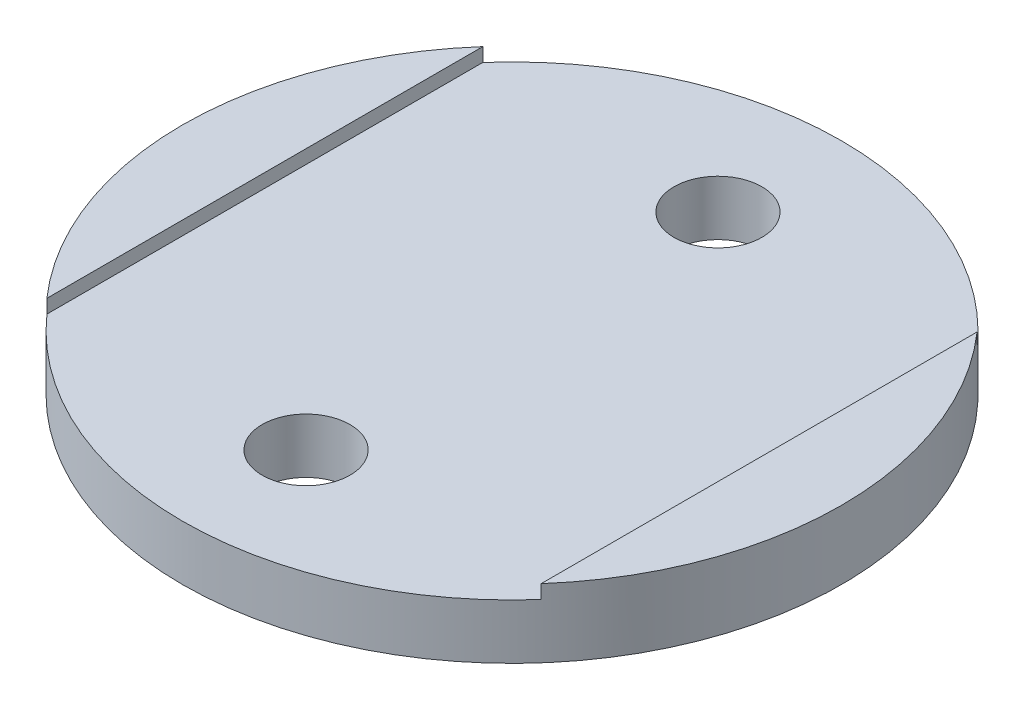
ISO-10303-21;
HEADER;
FILE_DESCRIPTION(('STEP AP214'),'2;1');
FILE_NAME('part.step','',(''),(''),'','','');
FILE_SCHEMA(('AUTOMOTIVE_DESIGN { 1 0 10303 214 1 1 1 1 }'));
ENDSEC;
DATA;
#1=APPLICATION_CONTEXT('core data for automotive mechanical design processes');
#2=APPLICATION_PROTOCOL_DEFINITION('international standard','automotive_design',2000,#1);
#3=PRODUCT_CONTEXT('',#1,'mechanical');
#4=PRODUCT('Part','Part','',(#3));
#5=PRODUCT_RELATED_PRODUCT_CATEGORY('part','',(#4));
#6=PRODUCT_DEFINITION_FORMATION('','',#4);
#7=PRODUCT_DEFINITION_CONTEXT('part definition',#1,'design');
#8=PRODUCT_DEFINITION('design','',#6,#7);
#9=PRODUCT_DEFINITION_SHAPE('','',#8);
#10=(LENGTH_UNIT() NAMED_UNIT(*) SI_UNIT(.MILLI.,.METRE.));
#11=(NAMED_UNIT(*) PLANE_ANGLE_UNIT() SI_UNIT($,.RADIAN.));
#12=(NAMED_UNIT(*) SI_UNIT($,.STERADIAN.) SOLID_ANGLE_UNIT());
#13=UNCERTAINTY_MEASURE_WITH_UNIT(LENGTH_MEASURE(1.E-05),#10,'distance_accuracy_value','');
#14=(GEOMETRIC_REPRESENTATION_CONTEXT(3) GLOBAL_UNCERTAINTY_ASSIGNED_CONTEXT((#13)) GLOBAL_UNIT_ASSIGNED_CONTEXT((#10,
#11,#12)) REPRESENTATION_CONTEXT('',''));
#15=CARTESIAN_POINT('',(0.,0.,0.));
#16=DIRECTION('',(0.,0.,1.));
#17=DIRECTION('',(1.,0.,0.));
#18=AXIS2_PLACEMENT_3D('',#15,#16,#17);
#19=CARTESIAN_POINT('',(0.,2.,0.));
#20=DIRECTION('',(0.,1.,0.));
#21=DIRECTION('',(0.,0.,1.));
#22=AXIS2_PLACEMENT_3D('',#19,#20,#21);
#23=PLANE('',#22);
#24=DIRECTION('',(0.,0.,-1.));
#25=VECTOR('',#24,1.);
#26=CARTESIAN_POINT('',(9.,2.,-7.93725393319378));
#27=LINE('',#26,#25);
#28=CARTESIAN_POINT('',(9.,2.,7.93725393319378));
#29=VERTEX_POINT('',#28);
#30=CARTESIAN_POINT('',(9.,2.,-7.93725393319378));
#31=VERTEX_POINT('',#30);
#32=EDGE_CURVE('E92',#29,#31,#27,.T.);
#33=ORIENTED_EDGE('',*,*,#32,.T.);
#34=CARTESIAN_POINT('',(0.,2.,0.));
#35=DIRECTION('',(0.,1.,0.));
#36=DIRECTION('',(0.,0.,1.));
#37=AXIS2_PLACEMENT_3D('',#34,#35,#36);
#38=CIRCLE('',#37,12.);
#39=CARTESIAN_POINT('',(-9.,2.,-7.93725393319378));
#40=VERTEX_POINT('',#39);
#41=EDGE_CURVE('E48',#31,#40,#38,.T.);
#42=ORIENTED_EDGE('',*,*,#41,.T.);
#43=DIRECTION('',(0.,0.,-1.));
#44=VECTOR('',#43,1.);
#45=CARTESIAN_POINT('',(-9.,2.,-7.93725393319378));
#46=LINE('',#45,#44);
#47=CARTESIAN_POINT('',(-9.,2.,7.93725393319378));
#48=VERTEX_POINT('',#47);
#49=EDGE_CURVE('E58',#48,#40,#46,.T.);
#50=ORIENTED_EDGE('',*,*,#49,.F.);
#51=EDGE_CURVE('E11',#48,#29,#38,.T.);
#52=ORIENTED_EDGE('',*,*,#51,.T.);
#53=EDGE_LOOP('',(#33,#42,#50,#52));
#54=FACE_BOUND('',#53,.T.);
#55=CARTESIAN_POINT('',(0.,2.,-7.5));
#56=DIRECTION('',(0.,1.,0.));
#57=DIRECTION('',(0.,0.,1.));
#58=AXIS2_PLACEMENT_3D('',#55,#56,#57);
#59=CIRCLE('',#58,1.6);
#60=CARTESIAN_POINT('',(0.,2.,-5.9));
#61=VERTEX_POINT('',#60);
#62=EDGE_CURVE('E117',#61,#61,#59,.T.);
#63=ORIENTED_EDGE('',*,*,#62,.F.);
#64=EDGE_LOOP('',(#63));
#65=FACE_BOUND('',#64,.T.);
#66=CARTESIAN_POINT('',(0.,2.,7.5));
#67=DIRECTION('',(0.,1.,0.));
#68=DIRECTION('',(0.,0.,-1.));
#69=AXIS2_PLACEMENT_3D('',#66,#67,#68);
#70=CIRCLE('',#69,1.6);
#71=CARTESIAN_POINT('',(0.,2.,5.9));
#72=VERTEX_POINT('',#71);
#73=EDGE_CURVE('E111',#72,#72,#70,.T.);
#74=ORIENTED_EDGE('',*,*,#73,.F.);
#75=EDGE_LOOP('',(#74));
#76=FACE_BOUND('',#75,.T.);
#77=ADVANCED_FACE('F39',(#54,#65,#76),#23,.T.);
#78=CARTESIAN_POINT('',(0.,0.,0.));
#79=DIRECTION('',(0.,1.,0.));
#80=DIRECTION('',(0.,0.,1.));
#81=AXIS2_PLACEMENT_3D('',#78,#79,#80);
#82=PLANE('',#81);
#83=CARTESIAN_POINT('',(0.,0.,0.));
#84=DIRECTION('',(0.,1.,0.));
#85=DIRECTION('',(0.,0.,1.));
#86=AXIS2_PLACEMENT_3D('',#83,#84,#85);
#87=CIRCLE('',#86,12.);
#88=CARTESIAN_POINT('',(0.,0.,12.));
#89=VERTEX_POINT('',#88);
#90=EDGE_CURVE('E43',#89,#89,#87,.T.);
#91=ORIENTED_EDGE('',*,*,#90,.F.);
#92=EDGE_LOOP('',(#91));
#93=FACE_BOUND('',#92,.T.);
#94=CARTESIAN_POINT('',(0.,0.,-7.5));
#95=DIRECTION('',(0.,1.,0.));
#96=DIRECTION('',(0.,0.,1.));
#97=AXIS2_PLACEMENT_3D('',#94,#95,#96);
#98=CIRCLE('',#97,1.6);
#99=CARTESIAN_POINT('',(0.,0.,-5.9));
#100=VERTEX_POINT('',#99);
#101=EDGE_CURVE('E114',#100,#100,#98,.T.);
#102=ORIENTED_EDGE('',*,*,#101,.T.);
#103=EDGE_LOOP('',(#102));
#104=FACE_BOUND('',#103,.T.);
#105=CARTESIAN_POINT('',(0.,0.,7.5));
#106=DIRECTION('',(0.,1.,0.));
#107=DIRECTION('',(0.,0.,-1.));
#108=AXIS2_PLACEMENT_3D('',#105,#106,#107);
#109=CIRCLE('',#108,1.6);
#110=CARTESIAN_POINT('',(0.,0.,5.9));
#111=VERTEX_POINT('',#110);
#112=EDGE_CURVE('E110',#111,#111,#109,.T.);
#113=ORIENTED_EDGE('',*,*,#112,.T.);
#114=EDGE_LOOP('',(#113));
#115=FACE_BOUND('',#114,.T.);
#116=ADVANCED_FACE('F123',(#93,#104,#115),#82,.F.);
#117=CARTESIAN_POINT('',(0.,2.,0.));
#118=DIRECTION('',(0.,-1.,0.));
#119=DIRECTION('',(0.,0.,-1.));
#120=AXIS2_PLACEMENT_3D('',#117,#118,#119);
#121=CYLINDRICAL_SURFACE('',#120,12.);
#122=ORIENTED_EDGE('',*,*,#51,.F.);
#123=DIRECTION('',(0.,-1.,0.));
#124=VECTOR('',#123,1.);
#125=CARTESIAN_POINT('',(-9.,2.5,7.93725393319378));
#126=LINE('',#125,#124);
#127=CARTESIAN_POINT('',(-9.,2.5,7.93725393319378));
#128=VERTEX_POINT('',#127);
#129=EDGE_CURVE('E107',#128,#48,#126,.T.);
#130=ORIENTED_EDGE('',*,*,#129,.F.);
#131=CARTESIAN_POINT('',(0.,2.5,0.));
#132=DIRECTION('',(0.,1.,0.));
#133=DIRECTION('',(0.,0.,1.));
#134=AXIS2_PLACEMENT_3D('',#131,#132,#133);
#135=CIRCLE('',#134,12.);
#136=CARTESIAN_POINT('',(-9.,2.5,-7.93725393319378));
#137=VERTEX_POINT('',#136);
#138=EDGE_CURVE('E99',#137,#128,#135,.T.);
#139=ORIENTED_EDGE('',*,*,#138,.F.);
#140=DIRECTION('',(0.,-1.,0.));
#141=VECTOR('',#140,1.);
#142=CARTESIAN_POINT('',(-9.,2.5,-7.93725393319378));
#143=LINE('',#142,#141);
#144=EDGE_CURVE('E104',#137,#40,#143,.T.);
#145=ORIENTED_EDGE('',*,*,#144,.T.);
#146=ORIENTED_EDGE('',*,*,#41,.F.);
#147=DIRECTION('',(0.,-1.,0.));
#148=VECTOR('',#147,1.);
#149=CARTESIAN_POINT('',(9.,2.5,-7.93725393319378));
#150=LINE('',#149,#148);
#151=CARTESIAN_POINT('',(9.,2.5,-7.93725393319378));
#152=VERTEX_POINT('',#151);
#153=EDGE_CURVE('E78',#152,#31,#150,.T.);
#154=ORIENTED_EDGE('',*,*,#153,.F.);
#155=CARTESIAN_POINT('',(0.,2.5,0.));
#156=DIRECTION('',(0.,-1.,0.));
#157=DIRECTION('',(0.,0.,1.));
#158=AXIS2_PLACEMENT_3D('',#155,#156,#157);
#159=CIRCLE('',#158,12.);
#160=CARTESIAN_POINT('',(9.,2.5,7.93725393319378));
#161=VERTEX_POINT('',#160);
#162=EDGE_CURVE('E81',#152,#161,#159,.T.);
#163=ORIENTED_EDGE('',*,*,#162,.T.);
#164=DIRECTION('',(0.,-1.,0.));
#165=VECTOR('',#164,1.);
#166=CARTESIAN_POINT('',(9.,2.5,7.93725393319378));
#167=LINE('',#166,#165);
#168=EDGE_CURVE('E87',#161,#29,#167,.T.);
#169=ORIENTED_EDGE('',*,*,#168,.T.);
#170=EDGE_LOOP('',(#122,#130,#139,#145,#146,#154,#163,#169));
#171=FACE_BOUND('',#170,.T.);
#172=ORIENTED_EDGE('',*,*,#90,.T.);
#173=EDGE_LOOP('',(#172));
#174=FACE_BOUND('',#173,.T.);
#175=ADVANCED_FACE('F41',(#171,#174),#121,.T.);
#176=CARTESIAN_POINT('',(0.,2.,-7.5));
#177=DIRECTION('',(0.,-1.,0.));
#178=DIRECTION('',(0.,0.,-1.));
#179=AXIS2_PLACEMENT_3D('',#176,#177,#178);
#180=CYLINDRICAL_SURFACE('',#179,1.6);
#181=ORIENTED_EDGE('',*,*,#62,.T.);
#182=EDGE_LOOP('',(#181));
#183=FACE_BOUND('',#182,.T.);
#184=ORIENTED_EDGE('',*,*,#101,.F.);
#185=EDGE_LOOP('',(#184));
#186=FACE_BOUND('',#185,.T.);
#187=ADVANCED_FACE('F126',(#183,#186),#180,.F.);
#188=CARTESIAN_POINT('',(0.,2.,7.5));
#189=DIRECTION('',(0.,-1.,0.));
#190=DIRECTION('',(0.,0.,-1.));
#191=AXIS2_PLACEMENT_3D('',#188,#189,#190);
#192=CYLINDRICAL_SURFACE('',#191,1.6);
#193=ORIENTED_EDGE('',*,*,#73,.T.);
#194=EDGE_LOOP('',(#193));
#195=FACE_BOUND('',#194,.T.);
#196=ORIENTED_EDGE('',*,*,#112,.F.);
#197=EDGE_LOOP('',(#196));
#198=FACE_BOUND('',#197,.T.);
#199=ADVANCED_FACE('F128',(#195,#198),#192,.F.);
#200=CARTESIAN_POINT('',(-9.,2.5,-7.93725393319378));
#201=DIRECTION('',(-1.,0.,0.));
#202=DIRECTION('',(0.,0.,1.));
#203=AXIS2_PLACEMENT_3D('',#200,#201,#202);
#204=PLANE('',#203);
#205=ORIENTED_EDGE('',*,*,#49,.T.);
#206=ORIENTED_EDGE('',*,*,#144,.F.);
#207=DIRECTION('',(0.,0.,-1.));
#208=VECTOR('',#207,1.);
#209=CARTESIAN_POINT('',(-9.,2.5,-7.93725393319378));
#210=LINE('',#209,#208);
#211=EDGE_CURVE('E102',#128,#137,#210,.T.);
#212=ORIENTED_EDGE('',*,*,#211,.F.);
#213=ORIENTED_EDGE('',*,*,#129,.T.);
#214=EDGE_LOOP('',(#205,#206,#212,#213));
#215=FACE_BOUND('',#214,.T.);
#216=ADVANCED_FACE('F135',(#215),#204,.F.);
#217=CARTESIAN_POINT('',(0.,2.5,0.));
#218=DIRECTION('',(0.,1.,0.));
#219=DIRECTION('',(0.,0.,1.));
#220=AXIS2_PLACEMENT_3D('',#217,#218,#219);
#221=PLANE('',#220);
#222=ORIENTED_EDGE('',*,*,#138,.T.);
#223=ORIENTED_EDGE('',*,*,#211,.T.);
#224=EDGE_LOOP('',(#222,#223));
#225=FACE_BOUND('',#224,.T.);
#226=ADVANCED_FACE('F157',(#225),#221,.T.);
#227=CARTESIAN_POINT('',(9.,2.5,-7.93725393319378));
#228=DIRECTION('',(-1.,0.,0.));
#229=DIRECTION('',(0.,0.,1.));
#230=AXIS2_PLACEMENT_3D('',#227,#228,#229);
#231=PLANE('',#230);
#232=ORIENTED_EDGE('',*,*,#32,.F.);
#233=ORIENTED_EDGE('',*,*,#168,.F.);
#234=DIRECTION('',(0.,0.,-1.));
#235=VECTOR('',#234,1.);
#236=CARTESIAN_POINT('',(9.,2.5,-7.93725393319378));
#237=LINE('',#236,#235);
#238=EDGE_CURVE('E91',#161,#152,#237,.T.);
#239=ORIENTED_EDGE('',*,*,#238,.T.);
#240=ORIENTED_EDGE('',*,*,#153,.T.);
#241=EDGE_LOOP('',(#232,#233,#239,#240));
#242=FACE_BOUND('',#241,.T.);
#243=ADVANCED_FACE('F94',(#242),#231,.T.);
#244=CARTESIAN_POINT('',(0.,2.5,0.));
#245=DIRECTION('',(0.,1.,0.));
#246=DIRECTION('',(0.,0.,1.));
#247=AXIS2_PLACEMENT_3D('',#244,#245,#246);
#248=PLANE('',#247);
#249=ORIENTED_EDGE('',*,*,#162,.F.);
#250=ORIENTED_EDGE('',*,*,#238,.F.);
#251=EDGE_LOOP('',(#249,#250));
#252=FACE_BOUND('',#251,.T.);
#253=ADVANCED_FACE('F90',(#252),#248,.T.);
#254=CLOSED_SHELL('',(#77,#116,#175,#187,#199,#216,#226,#243,#253));
#255=MANIFOLD_SOLID_BREP('B2',#254);
#256=ADVANCED_BREP_SHAPE_REPRESENTATION('',(#18,#255),#14);
#257=SHAPE_DEFINITION_REPRESENTATION(#9,#256);
ENDSEC;
END-ISO-10303-21;
